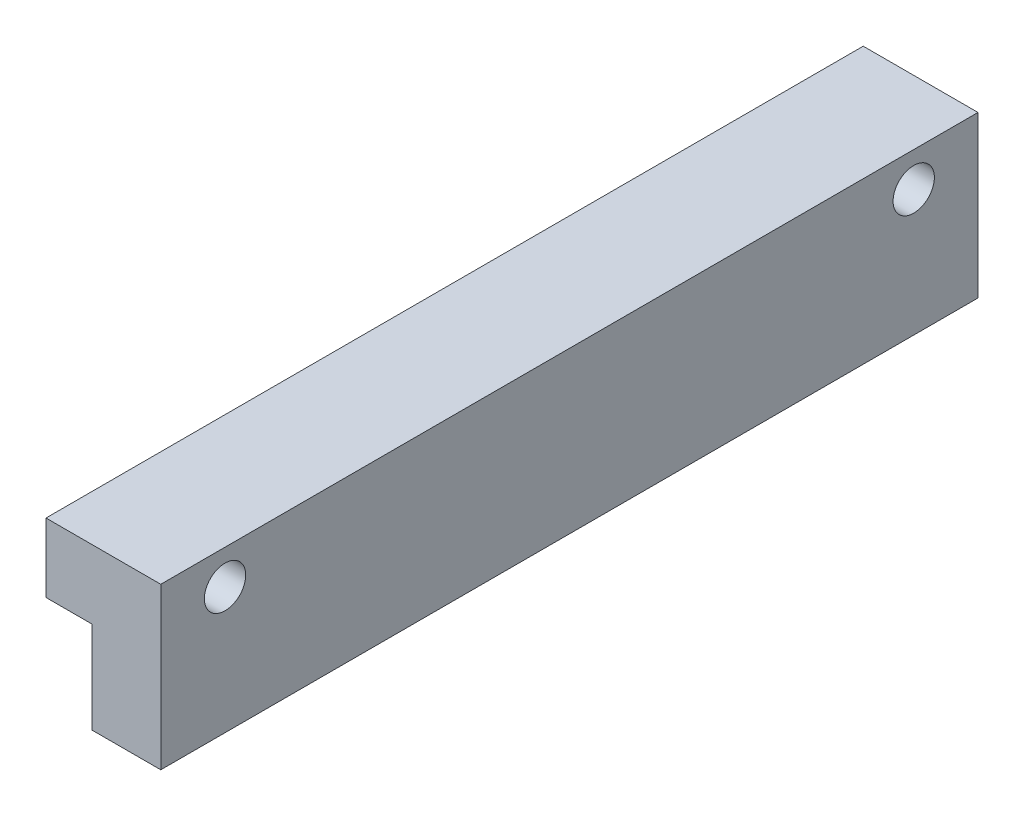
ISO-10303-21;
HEADER;
FILE_DESCRIPTION(('STEP AP214'),'2;1');
FILE_NAME('part.step','',(''),(''),'','','');
FILE_SCHEMA(('AUTOMOTIVE_DESIGN { 1 0 10303 214 1 1 1 1 }'));
ENDSEC;
DATA;
#1=APPLICATION_CONTEXT('core data for automotive mechanical design processes');
#2=APPLICATION_PROTOCOL_DEFINITION('international standard','automotive_design',2000,#1);
#3=PRODUCT_CONTEXT('',#1,'mechanical');
#4=PRODUCT('Part','Part','',(#3));
#5=PRODUCT_RELATED_PRODUCT_CATEGORY('part','',(#4));
#6=PRODUCT_DEFINITION_FORMATION('','',#4);
#7=PRODUCT_DEFINITION_CONTEXT('part definition',#1,'design');
#8=PRODUCT_DEFINITION('design','',#6,#7);
#9=PRODUCT_DEFINITION_SHAPE('','',#8);
#10=(LENGTH_UNIT() NAMED_UNIT(*) SI_UNIT(.MILLI.,.METRE.));
#11=(NAMED_UNIT(*) PLANE_ANGLE_UNIT() SI_UNIT($,.RADIAN.));
#12=(NAMED_UNIT(*) SI_UNIT($,.STERADIAN.) SOLID_ANGLE_UNIT());
#13=UNCERTAINTY_MEASURE_WITH_UNIT(LENGTH_MEASURE(1.E-05),#10,'distance_accuracy_value','');
#14=(GEOMETRIC_REPRESENTATION_CONTEXT(3) GLOBAL_UNCERTAINTY_ASSIGNED_CONTEXT((#13)) GLOBAL_UNIT_ASSIGNED_CONTEXT((#10,
#11,#12)) REPRESENTATION_CONTEXT('',''));
#15=CARTESIAN_POINT('',(0.,0.,0.));
#16=DIRECTION('',(0.,0.,1.));
#17=DIRECTION('',(1.,0.,0.));
#18=AXIS2_PLACEMENT_3D('',#15,#16,#17);
#19=CARTESIAN_POINT('',(0.,20.,89.));
#20=DIRECTION('',(1.,0.,0.));
#21=DIRECTION('',(0.,1.,0.));
#22=AXIS2_PLACEMENT_3D('',#19,#20,#21);
#23=PLANE('',#22);
#24=DIRECTION('',(0.,-1.,0.));
#25=VECTOR('',#24,1.);
#26=CARTESIAN_POINT('',(0.,20.,-89.));
#27=LINE('',#26,#25);
#28=CARTESIAN_POINT('',(0.,20.,-89.));
#29=VERTEX_POINT('',#28);
#30=CARTESIAN_POINT('',(0.,0.,-89.));
#31=VERTEX_POINT('',#30);
#32=EDGE_CURVE('E152',#29,#31,#27,.T.);
#33=ORIENTED_EDGE('',*,*,#32,.T.);
#34=DIRECTION('',(0.,0.,-1.));
#35=VECTOR('',#34,1.);
#36=CARTESIAN_POINT('',(0.,0.,89.));
#37=LINE('',#36,#35);
#38=CARTESIAN_POINT('',(0.,0.,89.));
#39=VERTEX_POINT('',#38);
#40=EDGE_CURVE('E11',#39,#31,#37,.T.);
#41=ORIENTED_EDGE('',*,*,#40,.F.);
#42=DIRECTION('',(0.,-1.,0.));
#43=VECTOR('',#42,1.);
#44=CARTESIAN_POINT('',(0.,20.,89.));
#45=LINE('',#44,#43);
#46=CARTESIAN_POINT('',(0.,20.,89.));
#47=VERTEX_POINT('',#46);
#48=EDGE_CURVE('E169',#47,#39,#45,.T.);
#49=ORIENTED_EDGE('',*,*,#48,.F.);
#50=DIRECTION('',(0.,0.,-1.));
#51=VECTOR('',#50,1.);
#52=CARTESIAN_POINT('',(0.,20.,89.));
#53=LINE('',#52,#51);
#54=EDGE_CURVE('E148',#47,#29,#53,.T.);
#55=ORIENTED_EDGE('',*,*,#54,.T.);
#56=EDGE_LOOP('',(#33,#41,#49,#55));
#57=FACE_BOUND('',#56,.T.);
#58=ADVANCED_FACE('F48',(#57),#23,.F.);
#59=CARTESIAN_POINT('',(0.,0.,89.));
#60=DIRECTION('',(0.,1.,0.));
#61=DIRECTION('',(0.,0.,1.));
#62=AXIS2_PLACEMENT_3D('',#59,#60,#61);
#63=PLANE('',#62);
#64=CARTESIAN_POINT('',(7.49999999999998,0.,70.));
#65=DIRECTION('',(0.,-1.,0.));
#66=DIRECTION('',(0.,0.,-1.));
#67=AXIS2_PLACEMENT_3D('',#64,#65,#66);
#68=CIRCLE('',#67,3.39999999999999);
#69=CARTESIAN_POINT('',(7.49999999999998,0.,66.6));
#70=VERTEX_POINT('',#69);
#71=EDGE_CURVE('E354',#70,#70,#68,.T.);
#72=ORIENTED_EDGE('',*,*,#71,.F.);
#73=EDGE_LOOP('',(#72));
#74=FACE_BOUND('',#73,.T.);
#75=CARTESIAN_POINT('',(7.49999999999998,0.,-70.));
#76=DIRECTION('',(0.,-1.,0.));
#77=DIRECTION('',(0.,0.,-1.));
#78=AXIS2_PLACEMENT_3D('',#75,#76,#77);
#79=CIRCLE('',#78,3.39999999999999);
#80=CARTESIAN_POINT('',(7.49999999999998,0.,-73.4));
#81=VERTEX_POINT('',#80);
#82=EDGE_CURVE('E333',#81,#81,#79,.T.);
#83=ORIENTED_EDGE('',*,*,#82,.F.);
#84=EDGE_LOOP('',(#83));
#85=FACE_BOUND('',#84,.T.);
#86=DIRECTION('',(1.,0.,0.));
#87=VECTOR('',#86,1.);
#88=CARTESIAN_POINT('',(0.,0.,-89.));
#89=LINE('',#88,#87);
#90=CARTESIAN_POINT('',(15.,0.,-89.));
#91=VERTEX_POINT('',#90);
#92=EDGE_CURVE('E156',#31,#91,#89,.T.);
#93=ORIENTED_EDGE('',*,*,#92,.T.);
#94=DIRECTION('',(0.,0.,-1.));
#95=VECTOR('',#94,1.);
#96=CARTESIAN_POINT('',(15.,0.,89.));
#97=LINE('',#96,#95);
#98=CARTESIAN_POINT('',(15.,0.,89.));
#99=VERTEX_POINT('',#98);
#100=EDGE_CURVE('E57',#99,#91,#97,.T.);
#101=ORIENTED_EDGE('',*,*,#100,.F.);
#102=DIRECTION('',(1.,0.,0.));
#103=VECTOR('',#102,1.);
#104=CARTESIAN_POINT('',(0.,0.,89.));
#105=LINE('',#104,#103);
#106=EDGE_CURVE('E114',#39,#99,#105,.T.);
#107=ORIENTED_EDGE('',*,*,#106,.F.);
#108=ORIENTED_EDGE('',*,*,#40,.T.);
#109=EDGE_LOOP('',(#93,#101,#107,#108));
#110=FACE_BOUND('',#109,.T.);
#111=ADVANCED_FACE('F198',(#74,#85,#110),#63,.F.);
#112=CARTESIAN_POINT('',(15.,0.,89.));
#113=DIRECTION('',(-1.,0.,0.));
#114=DIRECTION('',(0.,-1.,0.));
#115=AXIS2_PLACEMENT_3D('',#112,#113,#114);
#116=PLANE('',#115);
#117=CARTESIAN_POINT('',(15.,27.5,75.));
#118=DIRECTION('',(1.,0.,0.));
#119=DIRECTION('',(0.,0.,-1.));
#120=AXIS2_PLACEMENT_3D('',#117,#118,#119);
#121=CIRCLE('',#120,4.5);
#122=CARTESIAN_POINT('',(15.,27.5,70.5));
#123=VERTEX_POINT('',#122);
#124=EDGE_CURVE('E345',#123,#123,#121,.T.);
#125=ORIENTED_EDGE('',*,*,#124,.F.);
#126=EDGE_LOOP('',(#125));
#127=FACE_BOUND('',#126,.T.);
#128=CARTESIAN_POINT('',(15.,27.5,-75.));
#129=DIRECTION('',(1.,0.,0.));
#130=DIRECTION('',(0.,0.,-1.));
#131=AXIS2_PLACEMENT_3D('',#128,#129,#130);
#132=CIRCLE('',#131,4.5);
#133=CARTESIAN_POINT('',(15.,27.5,-79.5));
#134=VERTEX_POINT('',#133);
#135=EDGE_CURVE('E352',#134,#134,#132,.T.);
#136=ORIENTED_EDGE('',*,*,#135,.F.);
#137=EDGE_LOOP('',(#136));
#138=FACE_BOUND('',#137,.T.);
#139=DIRECTION('',(0.,1.,0.));
#140=VECTOR('',#139,1.);
#141=CARTESIAN_POINT('',(15.,0.,-89.));
#142=LINE('',#141,#140);
#143=CARTESIAN_POINT('',(15.,35.,-89.));
#144=VERTEX_POINT('',#143);
#145=EDGE_CURVE('E160',#91,#144,#142,.T.);
#146=ORIENTED_EDGE('',*,*,#145,.T.);
#147=DIRECTION('',(0.,0.,-1.));
#148=VECTOR('',#147,1.);
#149=CARTESIAN_POINT('',(15.,35.,89.));
#150=LINE('',#149,#148);
#151=CARTESIAN_POINT('',(15.,35.,89.));
#152=VERTEX_POINT('',#151);
#153=EDGE_CURVE('E141',#152,#144,#150,.T.);
#154=ORIENTED_EDGE('',*,*,#153,.F.);
#155=DIRECTION('',(0.,1.,0.));
#156=VECTOR('',#155,1.);
#157=CARTESIAN_POINT('',(15.,0.,89.));
#158=LINE('',#157,#156);
#159=EDGE_CURVE('E130',#99,#152,#158,.T.);
#160=ORIENTED_EDGE('',*,*,#159,.F.);
#161=ORIENTED_EDGE('',*,*,#100,.T.);
#162=EDGE_LOOP('',(#146,#154,#160,#161));
#163=FACE_BOUND('',#162,.T.);
#164=ADVANCED_FACE('F179',(#127,#138,#163),#116,.F.);
#165=CARTESIAN_POINT('',(15.,35.,89.));
#166=DIRECTION('',(0.,-1.,0.));
#167=DIRECTION('',(0.,0.,-1.));
#168=AXIS2_PLACEMENT_3D('',#165,#166,#167);
#169=PLANE('',#168);
#170=DIRECTION('',(-1.,0.,0.));
#171=VECTOR('',#170,1.);
#172=CARTESIAN_POINT('',(15.,35.,-89.));
#173=LINE('',#172,#171);
#174=CARTESIAN_POINT('',(-10.,35.,-89.));
#175=VERTEX_POINT('',#174);
#176=EDGE_CURVE('E139',#144,#175,#173,.T.);
#177=ORIENTED_EDGE('',*,*,#176,.T.);
#178=DIRECTION('',(0.,0.,-1.));
#179=VECTOR('',#178,1.);
#180=CARTESIAN_POINT('',(-10.,35.,89.));
#181=LINE('',#180,#179);
#182=CARTESIAN_POINT('',(-10.,35.,89.));
#183=VERTEX_POINT('',#182);
#184=EDGE_CURVE('E136',#183,#175,#181,.T.);
#185=ORIENTED_EDGE('',*,*,#184,.F.);
#186=DIRECTION('',(-1.,0.,0.));
#187=VECTOR('',#186,1.);
#188=CARTESIAN_POINT('',(15.,35.,89.));
#189=LINE('',#188,#187);
#190=EDGE_CURVE('E124',#152,#183,#189,.T.);
#191=ORIENTED_EDGE('',*,*,#190,.F.);
#192=ORIENTED_EDGE('',*,*,#153,.T.);
#193=EDGE_LOOP('',(#177,#185,#191,#192));
#194=FACE_BOUND('',#193,.T.);
#195=ADVANCED_FACE('F137',(#194),#169,.F.);
#196=CARTESIAN_POINT('',(-10.,35.,89.));
#197=DIRECTION('',(1.,0.,0.));
#198=DIRECTION('',(0.,1.,0.));
#199=AXIS2_PLACEMENT_3D('',#196,#197,#198);
#200=PLANE('',#199);
#201=CARTESIAN_POINT('',(-10.,27.5,75.));
#202=DIRECTION('',(1.,0.,0.));
#203=DIRECTION('',(0.,0.,-1.));
#204=AXIS2_PLACEMENT_3D('',#201,#202,#203);
#205=CIRCLE('',#204,4.5);
#206=CARTESIAN_POINT('',(-10.,27.5,70.5));
#207=VERTEX_POINT('',#206);
#208=EDGE_CURVE('E348',#207,#207,#205,.T.);
#209=ORIENTED_EDGE('',*,*,#208,.T.);
#210=EDGE_LOOP('',(#209));
#211=FACE_BOUND('',#210,.T.);
#212=CARTESIAN_POINT('',(-10.,27.5,-75.));
#213=DIRECTION('',(1.,0.,0.));
#214=DIRECTION('',(0.,0.,-1.));
#215=AXIS2_PLACEMENT_3D('',#212,#213,#214);
#216=CIRCLE('',#215,4.5);
#217=CARTESIAN_POINT('',(-10.,27.5,-79.5));
#218=VERTEX_POINT('',#217);
#219=EDGE_CURVE('E357',#218,#218,#216,.T.);
#220=ORIENTED_EDGE('',*,*,#219,.T.);
#221=EDGE_LOOP('',(#220));
#222=FACE_BOUND('',#221,.T.);
#223=DIRECTION('',(0.,-1.,0.));
#224=VECTOR('',#223,1.);
#225=CARTESIAN_POINT('',(-10.,35.,-89.));
#226=LINE('',#225,#224);
#227=CARTESIAN_POINT('',(-10.,20.,-89.));
#228=VERTEX_POINT('',#227);
#229=EDGE_CURVE('E98',#175,#228,#226,.T.);
#230=ORIENTED_EDGE('',*,*,#229,.T.);
#231=DIRECTION('',(0.,0.,-1.));
#232=VECTOR('',#231,1.);
#233=CARTESIAN_POINT('',(-10.,20.,89.));
#234=LINE('',#233,#232);
#235=CARTESIAN_POINT('',(-10.,20.,89.));
#236=VERTEX_POINT('',#235);
#237=EDGE_CURVE('E142',#236,#228,#234,.T.);
#238=ORIENTED_EDGE('',*,*,#237,.F.);
#239=DIRECTION('',(0.,-1.,0.));
#240=VECTOR('',#239,1.);
#241=CARTESIAN_POINT('',(-10.,35.,89.));
#242=LINE('',#241,#240);
#243=EDGE_CURVE('E128',#183,#236,#242,.T.);
#244=ORIENTED_EDGE('',*,*,#243,.F.);
#245=ORIENTED_EDGE('',*,*,#184,.T.);
#246=EDGE_LOOP('',(#230,#238,#244,#245));
#247=FACE_BOUND('',#246,.T.);
#248=ADVANCED_FACE('F144',(#211,#222,#247),#200,.F.);
#249=CARTESIAN_POINT('',(-10.,20.,89.));
#250=DIRECTION('',(0.,1.,0.));
#251=DIRECTION('',(0.,0.,1.));
#252=AXIS2_PLACEMENT_3D('',#249,#250,#251);
#253=PLANE('',#252);
#254=DIRECTION('',(1.,0.,0.));
#255=VECTOR('',#254,1.);
#256=CARTESIAN_POINT('',(-10.,20.,-89.));
#257=LINE('',#256,#255);
#258=EDGE_CURVE('E105',#228,#29,#257,.T.);
#259=ORIENTED_EDGE('',*,*,#258,.T.);
#260=ORIENTED_EDGE('',*,*,#54,.F.);
#261=DIRECTION('',(1.,0.,0.));
#262=VECTOR('',#261,1.);
#263=CARTESIAN_POINT('',(-10.,20.,89.));
#264=LINE('',#263,#262);
#265=EDGE_CURVE('E68',#236,#47,#264,.T.);
#266=ORIENTED_EDGE('',*,*,#265,.F.);
#267=ORIENTED_EDGE('',*,*,#237,.T.);
#268=EDGE_LOOP('',(#259,#260,#266,#267));
#269=FACE_BOUND('',#268,.T.);
#270=ADVANCED_FACE('F186',(#269),#253,.F.);
#271=CARTESIAN_POINT('',(0.,0.,89.));
#272=DIRECTION('',(0.,0.,1.));
#273=DIRECTION('',(1.,0.,0.));
#274=AXIS2_PLACEMENT_3D('',#271,#272,#273);
#275=PLANE('',#274);
#276=ORIENTED_EDGE('',*,*,#48,.T.);
#277=ORIENTED_EDGE('',*,*,#106,.T.);
#278=ORIENTED_EDGE('',*,*,#159,.T.);
#279=ORIENTED_EDGE('',*,*,#190,.T.);
#280=ORIENTED_EDGE('',*,*,#243,.T.);
#281=ORIENTED_EDGE('',*,*,#265,.T.);
#282=EDGE_LOOP('',(#276,#277,#278,#279,#280,#281));
#283=FACE_BOUND('',#282,.T.);
#284=ADVANCED_FACE('F126',(#283),#275,.T.);
#285=CARTESIAN_POINT('',(0.,0.,-89.));
#286=DIRECTION('',(0.,0.,1.));
#287=DIRECTION('',(1.,0.,0.));
#288=AXIS2_PLACEMENT_3D('',#285,#286,#287);
#289=PLANE('',#288);
#290=ORIENTED_EDGE('',*,*,#32,.F.);
#291=ORIENTED_EDGE('',*,*,#258,.F.);
#292=ORIENTED_EDGE('',*,*,#229,.F.);
#293=ORIENTED_EDGE('',*,*,#176,.F.);
#294=ORIENTED_EDGE('',*,*,#145,.F.);
#295=ORIENTED_EDGE('',*,*,#92,.F.);
#296=EDGE_LOOP('',(#290,#291,#292,#293,#294,#295));
#297=FACE_BOUND('',#296,.T.);
#298=ADVANCED_FACE('F182',(#297),#289,.F.);
#299=CARTESIAN_POINT('',(7.49999999999998,18.25,-70.));
#300=DIRECTION('',(0.,-1.,0.));
#301=DIRECTION('',(0.,0.,-1.));
#302=AXIS2_PLACEMENT_3D('',#299,#300,#301);
#303=CONICAL_SURFACE('',#302,3.4,1.02974425867665);
#304=CARTESIAN_POINT('',(7.49999999999998,20.2929261046937,-70.));
#305=VERTEX_POINT('',#304);
#306=VERTEX_LOOP('',#305);
#307=FACE_BOUND('',#306,.T.);
#308=CARTESIAN_POINT('',(7.49999999999998,18.25,-70.));
#309=DIRECTION('',(0.,-1.,0.));
#310=DIRECTION('',(0.,0.,-1.));
#311=AXIS2_PLACEMENT_3D('',#308,#309,#310);
#312=CIRCLE('',#311,3.4);
#313=CARTESIAN_POINT('',(7.49999999999998,18.25,-73.4));
#314=VERTEX_POINT('',#313);
#315=EDGE_CURVE('E157',#314,#314,#312,.T.);
#316=ORIENTED_EDGE('',*,*,#315,.T.);
#317=EDGE_LOOP('',(#316));
#318=FACE_BOUND('',#317,.T.);
#319=ADVANCED_FACE('F265',(#307,#318),#303,.F.);
#320=CARTESIAN_POINT('',(7.49999999999998,0.,-70.));
#321=DIRECTION('',(0.,-1.,0.));
#322=DIRECTION('',(0.,0.,-1.));
#323=AXIS2_PLACEMENT_3D('',#320,#321,#322);
#324=CYLINDRICAL_SURFACE('',#323,3.39999999999999);
#325=ORIENTED_EDGE('',*,*,#315,.F.);
#326=EDGE_LOOP('',(#325));
#327=FACE_BOUND('',#326,.T.);
#328=ORIENTED_EDGE('',*,*,#82,.T.);
#329=EDGE_LOOP('',(#328));
#330=FACE_BOUND('',#329,.T.);
#331=ADVANCED_FACE('F261',(#327,#330),#324,.F.);
#332=CARTESIAN_POINT('',(7.49999999999998,18.25,70.));
#333=DIRECTION('',(0.,-1.,0.));
#334=DIRECTION('',(0.,0.,-1.));
#335=AXIS2_PLACEMENT_3D('',#332,#333,#334);
#336=CONICAL_SURFACE('',#335,3.4,1.02974425867665);
#337=CARTESIAN_POINT('',(7.49999999999998,20.2929261046937,70.));
#338=VERTEX_POINT('',#337);
#339=VERTEX_LOOP('',#338);
#340=FACE_BOUND('',#339,.T.);
#341=CARTESIAN_POINT('',(7.49999999999998,18.25,70.));
#342=DIRECTION('',(0.,-1.,0.));
#343=DIRECTION('',(0.,0.,-1.));
#344=AXIS2_PLACEMENT_3D('',#341,#342,#343);
#345=CIRCLE('',#344,3.4);
#346=CARTESIAN_POINT('',(7.49999999999998,18.25,66.6));
#347=VERTEX_POINT('',#346);
#348=EDGE_CURVE('E336',#347,#347,#345,.T.);
#349=ORIENTED_EDGE('',*,*,#348,.T.);
#350=EDGE_LOOP('',(#349));
#351=FACE_BOUND('',#350,.T.);
#352=ADVANCED_FACE('F257',(#340,#351),#336,.F.);
#353=CARTESIAN_POINT('',(7.49999999999998,0.,70.));
#354=DIRECTION('',(0.,-1.,0.));
#355=DIRECTION('',(0.,0.,-1.));
#356=AXIS2_PLACEMENT_3D('',#353,#354,#355);
#357=CYLINDRICAL_SURFACE('',#356,3.39999999999999);
#358=ORIENTED_EDGE('',*,*,#348,.F.);
#359=EDGE_LOOP('',(#358));
#360=FACE_BOUND('',#359,.T.);
#361=ORIENTED_EDGE('',*,*,#71,.T.);
#362=EDGE_LOOP('',(#361));
#363=FACE_BOUND('',#362,.T.);
#364=ADVANCED_FACE('F237',(#360,#363),#357,.F.);
#365=CARTESIAN_POINT('',(15.,27.5,-75.));
#366=DIRECTION('',(1.,0.,0.));
#367=DIRECTION('',(0.,0.,-1.));
#368=AXIS2_PLACEMENT_3D('',#365,#366,#367);
#369=CYLINDRICAL_SURFACE('',#368,4.5);
#370=ORIENTED_EDGE('',*,*,#219,.F.);
#371=EDGE_LOOP('',(#370));
#372=FACE_BOUND('',#371,.T.);
#373=ORIENTED_EDGE('',*,*,#135,.T.);
#374=EDGE_LOOP('',(#373));
#375=FACE_BOUND('',#374,.T.);
#376=ADVANCED_FACE('F231',(#372,#375),#369,.F.);
#377=CARTESIAN_POINT('',(15.,27.5,75.));
#378=DIRECTION('',(1.,0.,0.));
#379=DIRECTION('',(0.,0.,-1.));
#380=AXIS2_PLACEMENT_3D('',#377,#378,#379);
#381=CYLINDRICAL_SURFACE('',#380,4.5);
#382=ORIENTED_EDGE('',*,*,#208,.F.);
#383=EDGE_LOOP('',(#382));
#384=FACE_BOUND('',#383,.T.);
#385=ORIENTED_EDGE('',*,*,#124,.T.);
#386=EDGE_LOOP('',(#385));
#387=FACE_BOUND('',#386,.T.);
#388=ADVANCED_FACE('F236',(#384,#387),#381,.F.);
#389=CLOSED_SHELL('',(#58,#111,#164,#195,#248,#270,#284,#298,#319,#331,#352,#364,#376,#388));
#390=MANIFOLD_SOLID_BREP('B2',#389);
#391=ADVANCED_BREP_SHAPE_REPRESENTATION('',(#18,#390),#14);
#392=SHAPE_DEFINITION_REPRESENTATION(#9,#391);
ENDSEC;
END-ISO-10303-21;
